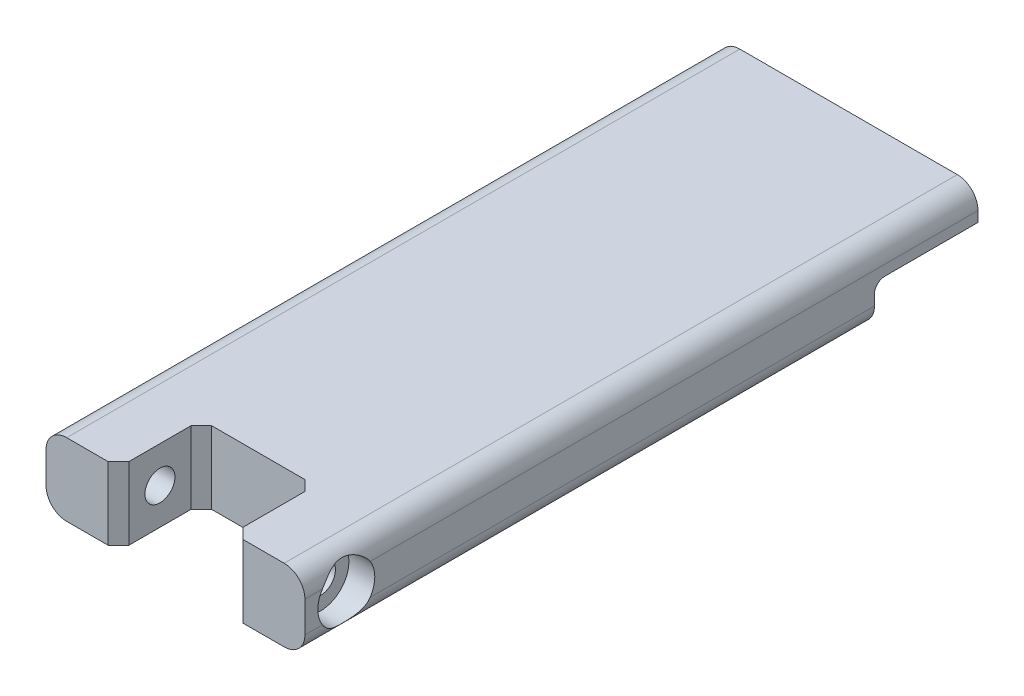
ISO-10303-21;
HEADER;
FILE_DESCRIPTION(('STEP AP214'),'2;1');
FILE_NAME('part.step','',(''),(''),'','','');
FILE_SCHEMA(('AUTOMOTIVE_DESIGN { 1 0 10303 214 1 1 1 1 }'));
ENDSEC;
DATA;
#1=APPLICATION_CONTEXT('core data for automotive mechanical design processes');
#2=APPLICATION_PROTOCOL_DEFINITION('international standard','automotive_design',2000,#1);
#3=PRODUCT_CONTEXT('',#1,'mechanical');
#4=PRODUCT('Part','Part','',(#3));
#5=PRODUCT_RELATED_PRODUCT_CATEGORY('part','',(#4));
#6=PRODUCT_DEFINITION_FORMATION('','',#4);
#7=PRODUCT_DEFINITION_CONTEXT('part definition',#1,'design');
#8=PRODUCT_DEFINITION('design','',#6,#7);
#9=PRODUCT_DEFINITION_SHAPE('','',#8);
#10=(LENGTH_UNIT() NAMED_UNIT(*) SI_UNIT(.MILLI.,.METRE.));
#11=(NAMED_UNIT(*) PLANE_ANGLE_UNIT() SI_UNIT($,.RADIAN.));
#12=(NAMED_UNIT(*) SI_UNIT($,.STERADIAN.) SOLID_ANGLE_UNIT());
#13=UNCERTAINTY_MEASURE_WITH_UNIT(LENGTH_MEASURE(1.E-05),#10,'distance_accuracy_value','');
#14=(GEOMETRIC_REPRESENTATION_CONTEXT(3) GLOBAL_UNCERTAINTY_ASSIGNED_CONTEXT((#13)) GLOBAL_UNIT_ASSIGNED_CONTEXT((#10,
#11,#12)) REPRESENTATION_CONTEXT('',''));
#15=CARTESIAN_POINT('',(0.,0.,0.));
#16=DIRECTION('',(0.,0.,1.));
#17=DIRECTION('',(1.,0.,0.));
#18=AXIS2_PLACEMENT_3D('',#15,#16,#17);
#19=CARTESIAN_POINT('',(-12.5,-3.5,65.));
#20=DIRECTION('',(0.,1.,0.));
#21=DIRECTION('',(0.,0.,1.));
#22=AXIS2_PLACEMENT_3D('',#19,#20,#21);
#23=PLANE('',#22);
#24=DIRECTION('',(-1.,0.,0.));
#25=VECTOR('',#24,1.);
#26=CARTESIAN_POINT('',(12.5,-3.5,10.));
#27=LINE('',#26,#25);
#28=CARTESIAN_POINT('',(10.5,-3.5,10.));
#29=VERTEX_POINT('',#28);
#30=CARTESIAN_POINT('',(-10.5,-3.5,10.));
#31=VERTEX_POINT('',#30);
#32=EDGE_CURVE('E411',#29,#31,#27,.T.);
#33=ORIENTED_EDGE('',*,*,#32,.F.);
#34=DIRECTION('',(0.,0.,-1.));
#35=VECTOR('',#34,1.);
#36=CARTESIAN_POINT('',(10.5,-3.5,65.));
#37=LINE('',#36,#35);
#38=CARTESIAN_POINT('',(10.5,-3.5,65.));
#39=VERTEX_POINT('',#38);
#40=EDGE_CURVE('E424',#29,#39,#37,.F.);
#41=ORIENTED_EDGE('',*,*,#40,.T.);
#42=DIRECTION('',(1.,0.,0.));
#43=VECTOR('',#42,1.);
#44=CARTESIAN_POINT('',(-12.5,-3.5,65.));
#45=LINE('',#44,#43);
#46=CARTESIAN_POINT('',(6.49999999999999,-3.5,65.));
#47=VERTEX_POINT('',#46);
#48=EDGE_CURVE('E364',#47,#39,#45,.T.);
#49=ORIENTED_EDGE('',*,*,#48,.F.);
#50=DIRECTION('',(0.707106781186545,0.,0.70710678118655));
#51=VECTOR('',#50,1.);
#52=CARTESIAN_POINT('',(5.5,-3.5,64.));
#53=LINE('',#52,#51);
#54=CARTESIAN_POINT('',(5.5,-3.5,64.));
#55=VERTEX_POINT('',#54);
#56=EDGE_CURVE('E454',#47,#55,#53,.F.);
#57=ORIENTED_EDGE('',*,*,#56,.T.);
#58=DIRECTION('',(0.,0.,-1.));
#59=VECTOR('',#58,1.);
#60=CARTESIAN_POINT('',(5.5,-3.5,65.));
#61=LINE('',#60,#59);
#62=CARTESIAN_POINT('',(5.5,-3.5,58.));
#63=VERTEX_POINT('',#62);
#64=EDGE_CURVE('E373',#55,#63,#61,.T.);
#65=ORIENTED_EDGE('',*,*,#64,.T.);
#66=DIRECTION('',(0.70710678118655,0.,0.707106781186545));
#67=VECTOR('',#66,1.);
#68=CARTESIAN_POINT('',(0.,-3.5,52.5));
#69=LINE('',#68,#67);
#70=CARTESIAN_POINT('',(4.49999999999999,-3.5,57.));
#71=VERTEX_POINT('',#70);
#72=EDGE_CURVE('E221',#63,#71,#69,.F.);
#73=ORIENTED_EDGE('',*,*,#72,.T.);
#74=DIRECTION('',(-1.,0.,0.));
#75=VECTOR('',#74,1.);
#76=CARTESIAN_POINT('',(-5.50000000000001,-3.5,57.));
#77=LINE('',#76,#75);
#78=CARTESIAN_POINT('',(-4.50000000000001,-3.5,57.));
#79=VERTEX_POINT('',#78);
#80=EDGE_CURVE('E371',#71,#79,#77,.T.);
#81=ORIENTED_EDGE('',*,*,#80,.T.);
#82=DIRECTION('',(0.707106781186545,0.,-0.70710678118655));
#83=VECTOR('',#82,1.);
#84=CARTESIAN_POINT('',(-12.5,-3.5,65.));
#85=LINE('',#84,#83);
#86=CARTESIAN_POINT('',(-5.50000000000001,-3.5,58.));
#87=VERTEX_POINT('',#86);
#88=EDGE_CURVE('E225',#79,#87,#85,.F.);
#89=ORIENTED_EDGE('',*,*,#88,.T.);
#90=DIRECTION('',(0.,0.,1.));
#91=VECTOR('',#90,1.);
#92=CARTESIAN_POINT('',(-5.50000000000001,-3.5,65.));
#93=LINE('',#92,#91);
#94=CARTESIAN_POINT('',(-5.50000000000001,-3.5,64.));
#95=VERTEX_POINT('',#94);
#96=EDGE_CURVE('E377',#87,#95,#93,.T.);
#97=ORIENTED_EDGE('',*,*,#96,.T.);
#98=DIRECTION('',(0.70710678118654,0.,-0.707106781186555));
#99=VECTOR('',#98,1.);
#100=CARTESIAN_POINT('',(-6.50000000000001,-3.5,65.));
#101=LINE('',#100,#99);
#102=CARTESIAN_POINT('',(-6.50000000000001,-3.5,65.));
#103=VERTEX_POINT('',#102);
#104=EDGE_CURVE('E452',#95,#103,#101,.F.);
#105=ORIENTED_EDGE('',*,*,#104,.T.);
#106=CARTESIAN_POINT('',(-10.5,-3.5,65.));
#107=VERTEX_POINT('',#106);
#108=EDGE_CURVE('E209',#107,#103,#45,.T.);
#109=ORIENTED_EDGE('',*,*,#108,.F.);
#110=DIRECTION('',(0.,0.,-1.));
#111=VECTOR('',#110,1.);
#112=CARTESIAN_POINT('',(-10.5,-3.5,65.));
#113=LINE('',#112,#111);
#114=EDGE_CURVE('E441',#107,#31,#113,.T.);
#115=ORIENTED_EDGE('',*,*,#114,.T.);
#116=EDGE_LOOP('',(#33,#41,#49,#57,#65,#73,#81,#89,#97,#105,#109,#115));
#117=FACE_BOUND('',#116,.T.);
#118=ADVANCED_FACE('F33',(#117),#23,.F.);
#119=CARTESIAN_POINT('',(-10.5,-1.5,65.));
#120=DIRECTION('',(0.,0.,-1.));
#121=DIRECTION('',(-1.,0.,0.));
#122=AXIS2_PLACEMENT_3D('',#119,#120,#121);
#123=CYLINDRICAL_SURFACE('',#122,2.);
#124=DIRECTION('',(0.,0.,-1.));
#125=VECTOR('',#124,1.);
#126=CARTESIAN_POINT('',(-12.5,-1.5,65.));
#127=LINE('',#126,#125);
#128=CARTESIAN_POINT('',(-12.5,-1.5,10.));
#129=VERTEX_POINT('',#128);
#130=CARTESIAN_POINT('',(-12.5,-1.5,65.));
#131=VERTEX_POINT('',#130);
#132=EDGE_CURVE('E227',#129,#131,#127,.F.);
#133=ORIENTED_EDGE('',*,*,#132,.F.);
#134=CARTESIAN_POINT('',(-10.5,-1.5,10.));
#135=DIRECTION('',(0.,0.,-1.));
#136=DIRECTION('',(-1.,0.,0.));
#137=AXIS2_PLACEMENT_3D('',#134,#135,#136);
#138=CIRCLE('',#137,2.);
#139=EDGE_CURVE('E354',#129,#31,#138,.F.);
#140=ORIENTED_EDGE('',*,*,#139,.T.);
#141=ORIENTED_EDGE('',*,*,#114,.F.);
#142=CARTESIAN_POINT('',(-10.5,-1.5,65.));
#143=DIRECTION('',(0.,0.,-1.));
#144=DIRECTION('',(-1.,0.,0.));
#145=AXIS2_PLACEMENT_3D('',#142,#143,#144);
#146=CIRCLE('',#145,2.);
#147=EDGE_CURVE('E245',#131,#107,#146,.F.);
#148=ORIENTED_EDGE('',*,*,#147,.F.);
#149=EDGE_LOOP('',(#133,#140,#141,#148));
#150=FACE_BOUND('',#149,.T.);
#151=ADVANCED_FACE('F317',(#150),#123,.T.);
#152=CARTESIAN_POINT('',(10.5,-1.5,65.));
#153=DIRECTION('',(0.,0.,-1.));
#154=DIRECTION('',(-1.,0.,0.));
#155=AXIS2_PLACEMENT_3D('',#152,#153,#154);
#156=CYLINDRICAL_SURFACE('',#155,2.);
#157=ORIENTED_EDGE('',*,*,#40,.F.);
#158=CARTESIAN_POINT('',(10.5,-1.5,10.));
#159=DIRECTION('',(0.,0.,-1.));
#160=DIRECTION('',(-1.,0.,0.));
#161=AXIS2_PLACEMENT_3D('',#158,#159,#160);
#162=CIRCLE('',#161,2.);
#163=CARTESIAN_POINT('',(12.5,-1.5,10.));
#164=VERTEX_POINT('',#163);
#165=EDGE_CURVE('E417',#29,#164,#162,.F.);
#166=ORIENTED_EDGE('',*,*,#165,.T.);
#167=DIRECTION('',(0.,0.,-1.));
#168=VECTOR('',#167,1.);
#169=CARTESIAN_POINT('',(12.5,-1.5,65.));
#170=LINE('',#169,#168);
#171=CARTESIAN_POINT('',(12.5,-1.5,58.6951138856773));
#172=VERTEX_POINT('',#171);
#173=EDGE_CURVE('E249',#172,#164,#170,.T.);
#174=ORIENTED_EDGE('',*,*,#173,.F.);
#175=CARTESIAN_POINT('',(12.5,-1.5,63.3048861143238));
#176=CARTESIAN_POINT('',(12.5000031455247,-1.55654719040747,63.2681015960545));
#177=CARTESIAN_POINT('',(12.4976030423075,-1.61168036140284,63.229244799416));
#178=CARTESIAN_POINT('',(12.4887327039993,-1.71866391916392,63.1478326561493));
#179=CARTESIAN_POINT('',(12.4822692231237,-1.77051959672422,63.1052835479124));
#180=CARTESIAN_POINT('',(12.4660769723939,-1.87023190709926,63.0172070499416));
#181=CARTESIAN_POINT('',(12.4563781599825,-1.91812037296953,62.9717099624892));
#182=CARTESIAN_POINT('',(12.4344014916754,-2.01022961709538,62.8777141967953));
#183=CARTESIAN_POINT('',(12.4221225443847,-2.05444883218452,62.829214254492));
#184=CARTESIAN_POINT('',(12.3826073001845,-2.18084035421773,62.6802695256216));
#185=CARTESIAN_POINT('',(12.3525619459295,-2.25743750555092,62.5757649259126));
#186=CARTESIAN_POINT('',(12.2900544015329,-2.39524100849854,62.357251168495));
#187=CARTESIAN_POINT('',(12.2575824702803,-2.45638047473159,62.2432034551855));
#188=CARTESIAN_POINT('',(12.1890009678127,-2.57370289713175,61.9814311601407));
#189=CARTESIAN_POINT('',(12.1535974487112,-2.62603303821094,61.8317188596248));
#190=CARTESIAN_POINT('',(12.1114688180424,-2.684796803544,61.6005625477079));
#191=CARTESIAN_POINT('',(12.0992647544686,-2.70108714983043,61.5225254315704));
#192=CARTESIAN_POINT('',(12.0795714424916,-2.72687504946342,61.3647323506282));
#193=CARTESIAN_POINT('',(12.0720805471391,-2.73637497578302,61.284976996324));
#194=CARTESIAN_POINT('',(12.0631457118318,-2.74764546944497,61.1340798855246));
#195=CARTESIAN_POINT('',(12.0610929340044,-2.75019531169201,61.0630312854767));
#196=CARTESIAN_POINT('',(12.0614247125385,-2.74978139960178,60.9209632345931));
#197=CARTESIAN_POINT('',(12.0638089539989,-2.74681803654396,60.8499437820466));
#198=CARTESIAN_POINT('',(12.0728200507609,-2.73543063833603,60.7085253878801));
#199=CARTESIAN_POINT('',(12.0794524513349,-2.72699946568053,60.6381273793954));
#200=CARTESIAN_POINT('',(12.0964251242216,-2.70483145596675,60.4986155034108));
#201=CARTESIAN_POINT('',(12.1067676975421,-2.69109132594348,60.4295024608732));
#202=CARTESIAN_POINT('',(12.144341342272,-2.6393296038762,60.2127876199724));
#203=CARTESIAN_POINT('',(12.1771439150733,-2.59173999499547,60.0683045143319));
#204=CARTESIAN_POINT('',(12.2302751739441,-2.50365392645819,59.8598455295542));
#205=CARTESIAN_POINT('',(12.2486732126794,-2.47144240385068,59.7916329045371));
#206=CARTESIAN_POINT('',(12.2857040022015,-2.4015705978906,59.6581231297031));
#207=CARTESIAN_POINT('',(12.3043367524611,-2.36391032677158,59.5928259733408));
#208=CARTESIAN_POINT('',(12.359683505685,-2.24140451758164,59.3993275811268));
#209=CARTESIAN_POINT('',(12.3951674318541,-2.1480412863694,59.2759132159634));
#210=CARTESIAN_POINT('',(12.4391492572644,-1.9925408853583,59.103089712563));
#211=CARTESIAN_POINT('',(12.4522530154153,-1.93824915848586,59.0476252909338));
#212=CARTESIAN_POINT('',(12.4743077235745,-1.82471924321772,58.9411319040245));
#213=CARTESIAN_POINT('',(12.4832629090084,-1.76548617287077,58.8900984584625));
#214=CARTESIAN_POINT('',(12.4929285728009,-1.67124019405483,58.8156913557658));
#215=CARTESIAN_POINT('',(12.4955363567126,-1.63781976970446,58.7905209062592));
#216=CARTESIAN_POINT('',(12.4990728191799,-1.56977969514719,58.7416713901846));
#217=CARTESIAN_POINT('',(12.5000001080821,-1.53515907654759,58.7179935735217));
#218=CARTESIAN_POINT('',(12.5,-1.5,58.6951138856773));
#219=B_SPLINE_CURVE_WITH_KNOTS('',3,(#175,#176,#177,#178,#179,#180,#181,#182,#183,#184,#185,
#186,#187,#188,#189,#190,#191,#192,#193,#194,#195,#196,#197,#198,#199,#200,#201,#202,#203,#204,
#205,#206,#207,#208,#209,#210,#211,#212,#213,#214,#215,#216,#217,#218),.UNSPECIFIED.,.F.,.F.,(4,
2,2,2,2,2,2,2,2,2,2,2,2,2,2,2,2,2,2,2,2,4),(0.,0.202207318065069,0.404079409178731,
0.604131887594807,0.804269159006677,1.20177087458337,1.60096422595491,2.08548459343883,
2.32707444122814,2.56857982195212,2.78161011892904,2.99462529744102,3.20791910043911,
3.42134541523357,3.88535369353779,4.11811425556195,4.35087429499951,4.8243625529269,
5.06021259924734,5.29582132430261,5.42151284487231,5.54730825630761),.UNSPECIFIED.);
#220=CARTESIAN_POINT('',(12.5,-1.5,63.3048861143238));
#221=VERTEX_POINT('',#220);
#222=EDGE_CURVE('E259',#221,#172,#219,.T.);
#223=ORIENTED_EDGE('',*,*,#222,.F.);
#224=DIRECTION('',(0.,0.,-1.));
#225=VECTOR('',#224,1.);
#226=CARTESIAN_POINT('',(12.5,-1.5,65.));
#227=LINE('',#226,#225);
#228=CARTESIAN_POINT('',(12.5,-1.5,65.));
#229=VERTEX_POINT('',#228);
#230=EDGE_CURVE('E252',#229,#221,#227,.T.);
#231=ORIENTED_EDGE('',*,*,#230,.F.);
#232=CARTESIAN_POINT('',(10.5,-1.5,65.));
#233=DIRECTION('',(0.,0.,-1.));
#234=DIRECTION('',(-1.,0.,0.));
#235=AXIS2_PLACEMENT_3D('',#232,#233,#234);
#236=CIRCLE('',#235,2.);
#237=EDGE_CURVE('E435',#39,#229,#236,.F.);
#238=ORIENTED_EDGE('',*,*,#237,.F.);
#239=EDGE_LOOP('',(#157,#166,#174,#223,#231,#238));
#240=FACE_BOUND('',#239,.T.);
#241=ADVANCED_FACE('F272',(#240),#156,.T.);
#242=CARTESIAN_POINT('',(12.5,-3.5,65.));
#243=DIRECTION('',(-1.,0.,0.));
#244=DIRECTION('',(0.,0.,1.));
#245=AXIS2_PLACEMENT_3D('',#242,#243,#244);
#246=PLANE('',#245);
#247=DIRECTION('',(0.,-1.,0.));
#248=VECTOR('',#247,1.);
#249=CARTESIAN_POINT('',(12.5,0.5,10.));
#250=LINE('',#249,#248);
#251=CARTESIAN_POINT('',(12.5,-0.5,10.));
#252=VERTEX_POINT('',#251);
#253=EDGE_CURVE('E189',#252,#164,#250,.T.);
#254=ORIENTED_EDGE('',*,*,#253,.F.);
#255=CARTESIAN_POINT('',(12.5,-0.5,9.));
#256=DIRECTION('',(-1.,0.,0.));
#257=DIRECTION('',(0.,0.,1.));
#258=AXIS2_PLACEMENT_3D('',#255,#256,#257);
#259=CIRCLE('',#258,1.);
#260=CARTESIAN_POINT('',(12.5,0.5,9.));
#261=VERTEX_POINT('',#260);
#262=EDGE_CURVE('E41',#252,#261,#259,.T.);
#263=ORIENTED_EDGE('',*,*,#262,.T.);
#264=DIRECTION('',(0.,0.,-1.));
#265=VECTOR('',#264,1.);
#266=CARTESIAN_POINT('',(12.5,0.5,10.));
#267=LINE('',#266,#265);
#268=CARTESIAN_POINT('',(12.5,0.5,0.));
#269=VERTEX_POINT('',#268);
#270=EDGE_CURVE('E180',#261,#269,#267,.T.);
#271=ORIENTED_EDGE('',*,*,#270,.T.);
#272=DIRECTION('',(0.,1.,0.));
#273=VECTOR('',#272,1.);
#274=CARTESIAN_POINT('',(12.5,-3.5,0.));
#275=LINE('',#274,#273);
#276=CARTESIAN_POINT('',(12.5,1.5,0.));
#277=VERTEX_POINT('',#276);
#278=EDGE_CURVE('E188',#269,#277,#275,.T.);
#279=ORIENTED_EDGE('',*,*,#278,.T.);
#280=DIRECTION('',(0.,0.,-1.));
#281=VECTOR('',#280,1.);
#282=CARTESIAN_POINT('',(12.5,1.5,65.));
#283=LINE('',#282,#281);
#284=CARTESIAN_POINT('',(12.5,1.5,58.6951138856773));
#285=VERTEX_POINT('',#284);
#286=EDGE_CURVE('E257',#277,#285,#283,.F.);
#287=ORIENTED_EDGE('',*,*,#286,.T.);
#288=CARTESIAN_POINT('',(12.5,0.,61.0000000000006));
#289=DIRECTION('',(1.,0.,0.));
#290=DIRECTION('',(0.,0.,-1.));
#291=AXIS2_PLACEMENT_3D('',#288,#289,#290);
#292=CIRCLE('',#291,2.75);
#293=EDGE_CURVE('E405',#172,#285,#292,.T.);
#294=ORIENTED_EDGE('',*,*,#293,.F.);
#295=ORIENTED_EDGE('',*,*,#173,.T.);
#296=EDGE_LOOP('',(#254,#263,#271,#279,#287,#294,#295));
#297=FACE_BOUND('',#296,.T.);
#298=ADVANCED_FACE('F330',(#297),#246,.F.);
#299=CARTESIAN_POINT('',(0.,0.,65.));
#300=DIRECTION('',(0.,0.,-1.));
#301=DIRECTION('',(-1.,0.,0.));
#302=AXIS2_PLACEMENT_3D('',#299,#300,#301);
#303=PLANE('',#302);
#304=ORIENTED_EDGE('',*,*,#108,.T.);
#305=DIRECTION('',(0.,1.,0.));
#306=VECTOR('',#305,1.);
#307=CARTESIAN_POINT('',(-6.50000000000001,0.,65.));
#308=LINE('',#307,#306);
#309=CARTESIAN_POINT('',(-6.50000000000001,3.5,65.));
#310=VERTEX_POINT('',#309);
#311=EDGE_CURVE('E456',#103,#310,#308,.T.);
#312=ORIENTED_EDGE('',*,*,#311,.T.);
#313=DIRECTION('',(-1.,0.,0.));
#314=VECTOR('',#313,1.);
#315=CARTESIAN_POINT('',(-12.5,3.5,65.));
#316=LINE('',#315,#314);
#317=CARTESIAN_POINT('',(-10.5,3.5,65.));
#318=VERTEX_POINT('',#317);
#319=EDGE_CURVE('E200',#310,#318,#316,.T.);
#320=ORIENTED_EDGE('',*,*,#319,.T.);
#321=CARTESIAN_POINT('',(-10.5,1.5,65.));
#322=DIRECTION('',(0.,0.,-1.));
#323=DIRECTION('',(-1.,0.,0.));
#324=AXIS2_PLACEMENT_3D('',#321,#322,#323);
#325=CIRCLE('',#324,2.);
#326=CARTESIAN_POINT('',(-12.5,1.5,65.));
#327=VERTEX_POINT('',#326);
#328=EDGE_CURVE('E247',#318,#327,#325,.F.);
#329=ORIENTED_EDGE('',*,*,#328,.T.);
#330=DIRECTION('',(0.,-1.,0.));
#331=VECTOR('',#330,1.);
#332=CARTESIAN_POINT('',(-12.5,-3.5,65.));
#333=LINE('',#332,#331);
#334=EDGE_CURVE('E358',#327,#131,#333,.T.);
#335=ORIENTED_EDGE('',*,*,#334,.T.);
#336=ORIENTED_EDGE('',*,*,#147,.T.);
#337=EDGE_LOOP('',(#304,#312,#320,#329,#335,#336));
#338=FACE_BOUND('',#337,.T.);
#339=ADVANCED_FACE('F312',(#338),#303,.F.);
#340=CARTESIAN_POINT('',(12.5,1.5,63.3048861143238));
#341=VERTEX_POINT('',#340);
#342=EDGE_CURVE('E404',#341,#221,#292,.T.);
#343=ORIENTED_EDGE('',*,*,#342,.F.);
#344=DIRECTION('',(0.,0.,-1.));
#345=VECTOR('',#344,1.);
#346=CARTESIAN_POINT('',(12.5,1.5,65.));
#347=LINE('',#346,#345);
#348=CARTESIAN_POINT('',(12.5,1.5,65.));
#349=VERTEX_POINT('',#348);
#350=EDGE_CURVE('E255',#341,#349,#347,.F.);
#351=ORIENTED_EDGE('',*,*,#350,.T.);
#352=DIRECTION('',(0.,1.,0.));
#353=VECTOR('',#352,1.);
#354=CARTESIAN_POINT('',(12.5,-3.5,65.));
#355=LINE('',#354,#353);
#356=EDGE_CURVE('E196',#229,#349,#355,.T.);
#357=ORIENTED_EDGE('',*,*,#356,.F.);
#358=ORIENTED_EDGE('',*,*,#230,.T.);
#359=EDGE_LOOP('',(#343,#351,#357,#358));
#360=FACE_BOUND('',#359,.T.);
#361=ADVANCED_FACE('F325',(#360),#246,.F.);
#362=CARTESIAN_POINT('',(-12.5,3.5,65.));
#363=DIRECTION('',(0.,-1.,0.));
#364=DIRECTION('',(0.,0.,-1.));
#365=AXIS2_PLACEMENT_3D('',#362,#363,#364);
#366=PLANE('',#365);
#367=DIRECTION('',(0.,0.,-1.));
#368=VECTOR('',#367,1.);
#369=CARTESIAN_POINT('',(5.5,3.5,65.));
#370=LINE('',#369,#368);
#371=CARTESIAN_POINT('',(5.5,3.5,64.));
#372=VERTEX_POINT('',#371);
#373=CARTESIAN_POINT('',(5.5,3.5,58.));
#374=VERTEX_POINT('',#373);
#375=EDGE_CURVE('E384',#372,#374,#370,.T.);
#376=ORIENTED_EDGE('',*,*,#375,.F.);
#377=DIRECTION('',(-0.707106781186545,0.,-0.70710678118655));
#378=VECTOR('',#377,1.);
#379=CARTESIAN_POINT('',(5.5,3.5,64.));
#380=LINE('',#379,#378);
#381=CARTESIAN_POINT('',(6.49999999999999,3.5,65.));
#382=VERTEX_POINT('',#381);
#383=EDGE_CURVE('E448',#372,#382,#380,.F.);
#384=ORIENTED_EDGE('',*,*,#383,.T.);
#385=CARTESIAN_POINT('',(10.5,3.5,65.));
#386=VERTEX_POINT('',#385);
#387=EDGE_CURVE('E365',#386,#382,#316,.T.);
#388=ORIENTED_EDGE('',*,*,#387,.F.);
#389=DIRECTION('',(0.,0.,-1.));
#390=VECTOR('',#389,1.);
#391=CARTESIAN_POINT('',(10.5,3.5,65.));
#392=LINE('',#391,#390);
#393=CARTESIAN_POINT('',(10.5,3.5,0.));
#394=VERTEX_POINT('',#393);
#395=EDGE_CURVE('E239',#386,#394,#392,.T.);
#396=ORIENTED_EDGE('',*,*,#395,.T.);
#397=DIRECTION('',(-1.,0.,0.));
#398=VECTOR('',#397,1.);
#399=CARTESIAN_POINT('',(-12.5,3.5,0.));
#400=LINE('',#399,#398);
#401=CARTESIAN_POINT('',(-10.5,3.5,0.));
#402=VERTEX_POINT('',#401);
#403=EDGE_CURVE('E197',#394,#402,#400,.T.);
#404=ORIENTED_EDGE('',*,*,#403,.T.);
#405=DIRECTION('',(0.,0.,-1.));
#406=VECTOR('',#405,1.);
#407=CARTESIAN_POINT('',(-10.5,3.5,65.));
#408=LINE('',#407,#406);
#409=EDGE_CURVE('E242',#402,#318,#408,.F.);
#410=ORIENTED_EDGE('',*,*,#409,.T.);
#411=ORIENTED_EDGE('',*,*,#319,.F.);
#412=DIRECTION('',(-0.70710678118654,0.,0.707106781186555));
#413=VECTOR('',#412,1.);
#414=CARTESIAN_POINT('',(-6.50000000000001,3.5,65.));
#415=LINE('',#414,#413);
#416=CARTESIAN_POINT('',(-5.50000000000001,3.5,64.));
#417=VERTEX_POINT('',#416);
#418=EDGE_CURVE('E446',#310,#417,#415,.F.);
#419=ORIENTED_EDGE('',*,*,#418,.T.);
#420=DIRECTION('',(0.,0.,1.));
#421=VECTOR('',#420,1.);
#422=CARTESIAN_POINT('',(-5.50000000000001,3.5,65.));
#423=LINE('',#422,#421);
#424=CARTESIAN_POINT('',(-5.50000000000001,3.5,58.));
#425=VERTEX_POINT('',#424);
#426=EDGE_CURVE('E381',#425,#417,#423,.T.);
#427=ORIENTED_EDGE('',*,*,#426,.F.);
#428=DIRECTION('',(-0.707106781186545,0.,0.70710678118655));
#429=VECTOR('',#428,1.);
#430=CARTESIAN_POINT('',(-12.5,3.5,65.));
#431=LINE('',#430,#429);
#432=CARTESIAN_POINT('',(-4.50000000000001,3.5,57.));
#433=VERTEX_POINT('',#432);
#434=EDGE_CURVE('E223',#425,#433,#431,.F.);
#435=ORIENTED_EDGE('',*,*,#434,.T.);
#436=DIRECTION('',(-1.,0.,0.));
#437=VECTOR('',#436,1.);
#438=CARTESIAN_POINT('',(-5.50000000000001,3.5,57.));
#439=LINE('',#438,#437);
#440=CARTESIAN_POINT('',(4.49999999999999,3.5,57.));
#441=VERTEX_POINT('',#440);
#442=EDGE_CURVE('E386',#441,#433,#439,.T.);
#443=ORIENTED_EDGE('',*,*,#442,.F.);
#444=DIRECTION('',(-0.70710678118655,0.,-0.707106781186545));
#445=VECTOR('',#444,1.);
#446=CARTESIAN_POINT('',(0.,3.5,52.5));
#447=LINE('',#446,#445);
#448=EDGE_CURVE('E218',#441,#374,#447,.F.);
#449=ORIENTED_EDGE('',*,*,#448,.T.);
#450=EDGE_LOOP('',(#376,#384,#388,#396,#404,#410,#411,#419,#427,#435,#443,#449));
#451=FACE_BOUND('',#450,.T.);
#452=ADVANCED_FACE('F321',(#451),#366,.F.);
#453=CARTESIAN_POINT('',(-12.5,-3.5,65.));
#454=DIRECTION('',(1.,0.,0.));
#455=DIRECTION('',(0.,0.,-1.));
#456=AXIS2_PLACEMENT_3D('',#453,#454,#455);
#457=PLANE('',#456);
#458=CARTESIAN_POINT('',(-12.5,0.,61.0000000000006));
#459=DIRECTION('',(1.,0.,0.));
#460=DIRECTION('',(0.,0.,-1.));
#461=AXIS2_PLACEMENT_3D('',#458,#459,#460);
#462=CIRCLE('',#461,1.44999999999999);
#463=CARTESIAN_POINT('',(-12.5,0.,59.5500000000006));
#464=VERTEX_POINT('',#463);
#465=EDGE_CURVE('E232',#464,#464,#462,.T.);
#466=ORIENTED_EDGE('',*,*,#465,.T.);
#467=EDGE_LOOP('',(#466));
#468=FACE_BOUND('',#467,.T.);
#469=DIRECTION('',(0.,-1.,0.));
#470=VECTOR('',#469,1.);
#471=CARTESIAN_POINT('',(-12.5,-3.5,0.));
#472=LINE('',#471,#470);
#473=CARTESIAN_POINT('',(-12.5,1.5,0.));
#474=VERTEX_POINT('',#473);
#475=CARTESIAN_POINT('',(-12.5,0.5,0.));
#476=VERTEX_POINT('',#475);
#477=EDGE_CURVE('E186',#474,#476,#472,.T.);
#478=ORIENTED_EDGE('',*,*,#477,.T.);
#479=DIRECTION('',(0.,0.,-1.));
#480=VECTOR('',#479,1.);
#481=CARTESIAN_POINT('',(-12.5,0.5,10.));
#482=LINE('',#481,#480);
#483=CARTESIAN_POINT('',(-12.5,0.5,9.));
#484=VERTEX_POINT('',#483);
#485=EDGE_CURVE('E172',#484,#476,#482,.T.);
#486=ORIENTED_EDGE('',*,*,#485,.F.);
#487=CARTESIAN_POINT('',(-12.5,-0.5,9.));
#488=DIRECTION('',(1.,0.,0.));
#489=DIRECTION('',(0.,0.,-1.));
#490=AXIS2_PLACEMENT_3D('',#487,#488,#489);
#491=CIRCLE('',#490,1.);
#492=CARTESIAN_POINT('',(-12.5,-0.5,10.));
#493=VERTEX_POINT('',#492);
#494=EDGE_CURVE('E11',#484,#493,#491,.T.);
#495=ORIENTED_EDGE('',*,*,#494,.T.);
#496=DIRECTION('',(0.,1.,0.));
#497=VECTOR('',#496,1.);
#498=CARTESIAN_POINT('',(-12.5,0.5,10.));
#499=LINE('',#498,#497);
#500=EDGE_CURVE('E181',#129,#493,#499,.T.);
#501=ORIENTED_EDGE('',*,*,#500,.F.);
#502=ORIENTED_EDGE('',*,*,#132,.T.);
#503=ORIENTED_EDGE('',*,*,#334,.F.);
#504=DIRECTION('',(0.,0.,-1.));
#505=VECTOR('',#504,1.);
#506=CARTESIAN_POINT('',(-12.5,1.5,65.));
#507=LINE('',#506,#505);
#508=EDGE_CURVE('E195',#327,#474,#507,.T.);
#509=ORIENTED_EDGE('',*,*,#508,.T.);
#510=EDGE_LOOP('',(#478,#486,#495,#501,#502,#503,#509));
#511=FACE_BOUND('',#510,.T.);
#512=ADVANCED_FACE('F192',(#468,#511),#457,.F.);
#513=ORIENTED_EDGE('',*,*,#387,.T.);
#514=DIRECTION('',(0.,-1.,0.));
#515=VECTOR('',#514,1.);
#516=CARTESIAN_POINT('',(6.49999999999999,0.,65.));
#517=LINE('',#516,#515);
#518=EDGE_CURVE('E450',#382,#47,#517,.T.);
#519=ORIENTED_EDGE('',*,*,#518,.T.);
#520=ORIENTED_EDGE('',*,*,#48,.T.);
#521=ORIENTED_EDGE('',*,*,#237,.T.);
#522=ORIENTED_EDGE('',*,*,#356,.T.);
#523=CARTESIAN_POINT('',(10.5,1.5,65.));
#524=DIRECTION('',(0.,0.,-1.));
#525=DIRECTION('',(-1.,0.,0.));
#526=AXIS2_PLACEMENT_3D('',#523,#524,#525);
#527=CIRCLE('',#526,2.);
#528=EDGE_CURVE('E436',#349,#386,#527,.F.);
#529=ORIENTED_EDGE('',*,*,#528,.T.);
#530=EDGE_LOOP('',(#513,#519,#520,#521,#522,#529));
#531=FACE_BOUND('',#530,.T.);
#532=ADVANCED_FACE('F308',(#531),#303,.F.);
#533=CARTESIAN_POINT('',(0.,0.,0.));
#534=DIRECTION('',(0.,0.,-1.));
#535=DIRECTION('',(-1.,0.,0.));
#536=AXIS2_PLACEMENT_3D('',#533,#534,#535);
#537=PLANE('',#536);
#538=DIRECTION('',(1.,0.,0.));
#539=VECTOR('',#538,1.);
#540=CARTESIAN_POINT('',(12.5,0.5,0.));
#541=LINE('',#540,#539);
#542=EDGE_CURVE('E175',#476,#269,#541,.T.);
#543=ORIENTED_EDGE('',*,*,#542,.F.);
#544=ORIENTED_EDGE('',*,*,#477,.F.);
#545=CARTESIAN_POINT('',(-10.5,1.5,0.));
#546=DIRECTION('',(0.,0.,-1.));
#547=DIRECTION('',(-1.,0.,0.));
#548=AXIS2_PLACEMENT_3D('',#545,#546,#547);
#549=CIRCLE('',#548,2.);
#550=EDGE_CURVE('E237',#474,#402,#549,.T.);
#551=ORIENTED_EDGE('',*,*,#550,.T.);
#552=ORIENTED_EDGE('',*,*,#403,.F.);
#553=CARTESIAN_POINT('',(10.5,1.5,0.));
#554=DIRECTION('',(0.,0.,-1.));
#555=DIRECTION('',(-1.,0.,0.));
#556=AXIS2_PLACEMENT_3D('',#553,#554,#555);
#557=CIRCLE('',#556,2.);
#558=EDGE_CURVE('E235',#394,#277,#557,.T.);
#559=ORIENTED_EDGE('',*,*,#558,.T.);
#560=ORIENTED_EDGE('',*,*,#278,.F.);
#561=EDGE_LOOP('',(#543,#544,#551,#552,#559,#560));
#562=FACE_BOUND('',#561,.T.);
#563=ADVANCED_FACE('F185',(#562),#537,.T.);
#564=CARTESIAN_POINT('',(-5.50000000000001,-3.5,65.));
#565=DIRECTION('',(-1.,0.,0.));
#566=DIRECTION('',(0.,0.,1.));
#567=AXIS2_PLACEMENT_3D('',#564,#565,#566);
#568=PLANE('',#567);
#569=CARTESIAN_POINT('',(-5.50000000000001,0.,61.0000000000006));
#570=DIRECTION('',(-1.,0.,0.));
#571=DIRECTION('',(0.,0.,1.));
#572=AXIS2_PLACEMENT_3D('',#569,#570,#571);
#573=CIRCLE('',#572,1.45);
#574=CARTESIAN_POINT('',(-5.50000000000001,0.,62.4500000000006));
#575=VERTEX_POINT('',#574);
#576=EDGE_CURVE('E231',#575,#575,#573,.T.);
#577=ORIENTED_EDGE('',*,*,#576,.T.);
#578=EDGE_LOOP('',(#577));
#579=FACE_BOUND('',#578,.T.);
#580=ORIENTED_EDGE('',*,*,#426,.T.);
#581=DIRECTION('',(0.,-1.,0.));
#582=VECTOR('',#581,1.);
#583=CARTESIAN_POINT('',(-5.50000000000001,-3.5,64.));
#584=LINE('',#583,#582);
#585=EDGE_CURVE('E425',#417,#95,#584,.T.);
#586=ORIENTED_EDGE('',*,*,#585,.T.);
#587=ORIENTED_EDGE('',*,*,#96,.F.);
#588=DIRECTION('',(0.,1.,0.));
#589=VECTOR('',#588,1.);
#590=CARTESIAN_POINT('',(-5.50000000000001,3.5,58.));
#591=LINE('',#590,#589);
#592=EDGE_CURVE('E215',#87,#425,#591,.T.);
#593=ORIENTED_EDGE('',*,*,#592,.T.);
#594=EDGE_LOOP('',(#580,#586,#587,#593));
#595=FACE_BOUND('',#594,.T.);
#596=ADVANCED_FACE('F299',(#579,#595),#568,.F.);
#597=CARTESIAN_POINT('',(-5.50000000000001,-3.5,57.));
#598=DIRECTION('',(0.,0.,-1.));
#599=DIRECTION('',(-1.,0.,0.));
#600=AXIS2_PLACEMENT_3D('',#597,#598,#599);
#601=PLANE('',#600);
#602=ORIENTED_EDGE('',*,*,#80,.F.);
#603=DIRECTION('',(0.,1.,0.));
#604=VECTOR('',#603,1.);
#605=CARTESIAN_POINT('',(4.49999999999999,3.5,57.));
#606=LINE('',#605,#604);
#607=EDGE_CURVE('E208',#71,#441,#606,.T.);
#608=ORIENTED_EDGE('',*,*,#607,.T.);
#609=ORIENTED_EDGE('',*,*,#442,.T.);
#610=DIRECTION('',(0.,-1.,0.));
#611=VECTOR('',#610,1.);
#612=CARTESIAN_POINT('',(-4.50000000000001,-3.5,57.));
#613=LINE('',#612,#611);
#614=EDGE_CURVE('E206',#433,#79,#613,.T.);
#615=ORIENTED_EDGE('',*,*,#614,.T.);
#616=EDGE_LOOP('',(#602,#608,#609,#615));
#617=FACE_BOUND('',#616,.T.);
#618=ADVANCED_FACE('F295',(#617),#601,.F.);
#619=CARTESIAN_POINT('',(5.5,-3.5,65.));
#620=DIRECTION('',(1.,0.,0.));
#621=DIRECTION('',(0.,0.,-1.));
#622=AXIS2_PLACEMENT_3D('',#619,#620,#621);
#623=PLANE('',#622);
#624=CARTESIAN_POINT('',(5.5,0.,61.0000000000006));
#625=DIRECTION('',(1.,0.,0.));
#626=DIRECTION('',(0.,0.,-1.));
#627=AXIS2_PLACEMENT_3D('',#624,#625,#626);
#628=CIRCLE('',#627,1.45);
#629=CARTESIAN_POINT('',(5.5,0.,59.5500000000006));
#630=VERTEX_POINT('',#629);
#631=EDGE_CURVE('E228',#630,#630,#628,.T.);
#632=ORIENTED_EDGE('',*,*,#631,.T.);
#633=EDGE_LOOP('',(#632));
#634=FACE_BOUND('',#633,.T.);
#635=ORIENTED_EDGE('',*,*,#64,.F.);
#636=DIRECTION('',(0.,1.,0.));
#637=VECTOR('',#636,1.);
#638=CARTESIAN_POINT('',(5.5,-3.5,64.));
#639=LINE('',#638,#637);
#640=EDGE_CURVE('E443',#55,#372,#639,.T.);
#641=ORIENTED_EDGE('',*,*,#640,.T.);
#642=ORIENTED_EDGE('',*,*,#375,.T.);
#643=DIRECTION('',(0.,-1.,0.));
#644=VECTOR('',#643,1.);
#645=CARTESIAN_POINT('',(5.5,-3.5,58.));
#646=LINE('',#645,#644);
#647=EDGE_CURVE('E212',#374,#63,#646,.T.);
#648=ORIENTED_EDGE('',*,*,#647,.T.);
#649=EDGE_LOOP('',(#635,#641,#642,#648));
#650=FACE_BOUND('',#649,.T.);
#651=ADVANCED_FACE('F298',(#634,#650),#623,.F.);
#652=CARTESIAN_POINT('',(4.49999999999999,-3.5,57.));
#653=DIRECTION('',(-0.707106781186545,0.,0.70710678118655));
#654=DIRECTION('',(0.,-1.,0.));
#655=AXIS2_PLACEMENT_3D('',#652,#653,#654);
#656=PLANE('',#655);
#657=ORIENTED_EDGE('',*,*,#72,.F.);
#658=ORIENTED_EDGE('',*,*,#647,.F.);
#659=ORIENTED_EDGE('',*,*,#448,.F.);
#660=ORIENTED_EDGE('',*,*,#607,.F.);
#661=EDGE_LOOP('',(#657,#658,#659,#660));
#662=FACE_BOUND('',#661,.T.);
#663=ADVANCED_FACE('F303',(#662),#656,.T.);
#664=CARTESIAN_POINT('',(-5.50000000000001,-3.5,58.));
#665=DIRECTION('',(0.70710678118655,0.,0.707106781186545));
#666=DIRECTION('',(0.,-1.,0.));
#667=AXIS2_PLACEMENT_3D('',#664,#665,#666);
#668=PLANE('',#667);
#669=ORIENTED_EDGE('',*,*,#88,.F.);
#670=ORIENTED_EDGE('',*,*,#614,.F.);
#671=ORIENTED_EDGE('',*,*,#434,.F.);
#672=ORIENTED_EDGE('',*,*,#592,.F.);
#673=EDGE_LOOP('',(#669,#670,#671,#672));
#674=FACE_BOUND('',#673,.T.);
#675=ADVANCED_FACE('F282',(#674),#668,.T.);
#676=CARTESIAN_POINT('',(12.5,0.,61.0000000000006));
#677=DIRECTION('',(1.,0.,0.));
#678=DIRECTION('',(0.,0.,-1.));
#679=AXIS2_PLACEMENT_3D('',#676,#677,#678);
#680=CYLINDRICAL_SURFACE('',#679,2.75);
#681=CARTESIAN_POINT('',(9.99999999999999,0.,61.0000000000006));
#682=DIRECTION('',(1.,0.,0.));
#683=DIRECTION('',(0.,0.,-1.));
#684=AXIS2_PLACEMENT_3D('',#681,#682,#683);
#685=CIRCLE('',#684,2.75);
#686=CARTESIAN_POINT('',(9.99999999999999,0.,58.2500000000006));
#687=VERTEX_POINT('',#686);
#688=EDGE_CURVE('E401',#687,#687,#685,.T.);
#689=ORIENTED_EDGE('',*,*,#688,.F.);
#690=EDGE_LOOP('',(#689));
#691=FACE_BOUND('',#690,.T.);
#692=ORIENTED_EDGE('',*,*,#293,.T.);
#693=CARTESIAN_POINT('',(12.5,1.5,58.6951138856773));
#694=CARTESIAN_POINT('',(12.5000031455247,1.55654719040747,58.7318984039466));
#695=CARTESIAN_POINT('',(12.4976030423075,1.61168036140283,58.7707552005851));
#696=CARTESIAN_POINT('',(12.4887327039993,1.71866391916391,58.8521673438518));
#697=CARTESIAN_POINT('',(12.4822692231237,1.77051959672422,58.8947164520887));
#698=CARTESIAN_POINT('',(12.4660769723939,1.87023190709926,58.9827929500595));
#699=CARTESIAN_POINT('',(12.4563781599825,1.91812037296952,59.0282900375119));
#700=CARTESIAN_POINT('',(12.4344014916754,2.01022961709538,59.1222858032058));
#701=CARTESIAN_POINT('',(12.4221225443847,2.05444883218452,59.1707857455091));
#702=CARTESIAN_POINT('',(12.3826073001845,2.18084035421773,59.3197304743795));
#703=CARTESIAN_POINT('',(12.3525619459295,2.25743750555092,59.4242350740885));
#704=CARTESIAN_POINT('',(12.2900544015329,2.39524100849854,59.6427488315061));
#705=CARTESIAN_POINT('',(12.2575824702803,2.45638047473159,59.7567965448156));
#706=CARTESIAN_POINT('',(12.1890009678127,2.57370289713175,60.0185688398604));
#707=CARTESIAN_POINT('',(12.1535974487112,2.62603303821094,60.1682811403763));
#708=CARTESIAN_POINT('',(12.1114688180424,2.684796803544,60.3994374522932));
#709=CARTESIAN_POINT('',(12.0992647544686,2.70108714983043,60.4774745684307));
#710=CARTESIAN_POINT('',(12.0795714424915,2.72687504946342,60.6352676493729));
#711=CARTESIAN_POINT('',(12.0720805471391,2.73637497578302,60.7150230036771));
#712=CARTESIAN_POINT('',(12.0631457118318,2.74764546944497,60.8659201144764));
#713=CARTESIAN_POINT('',(12.0610929340044,2.75019531169201,60.9369687145244));
#714=CARTESIAN_POINT('',(12.0614247125385,2.74978139960178,61.079036765408));
#715=CARTESIAN_POINT('',(12.0638089539989,2.74681803654397,61.1500562179544));
#716=CARTESIAN_POINT('',(12.0728200507609,2.73543063833604,61.2914746121209));
#717=CARTESIAN_POINT('',(12.0794524513349,2.72699946568053,61.3618726206057));
#718=CARTESIAN_POINT('',(12.0964251242216,2.70483145596675,61.5013844965903));
#719=CARTESIAN_POINT('',(12.1067676975421,2.69109132594348,61.5704975391278));
#720=CARTESIAN_POINT('',(12.144341342272,2.63932960387621,61.7872123800287));
#721=CARTESIAN_POINT('',(12.1771439150733,2.59173999499549,61.9316954856691));
#722=CARTESIAN_POINT('',(12.230275173944,2.5036539264582,62.1401544704469));
#723=CARTESIAN_POINT('',(12.2486732126794,2.47144240385069,62.208367095464));
#724=CARTESIAN_POINT('',(12.2857040022015,2.40157059789061,62.341876870298));
#725=CARTESIAN_POINT('',(12.3043367524611,2.36391032677159,62.4071740266602));
#726=CARTESIAN_POINT('',(12.359683505685,2.24140451758166,62.6006724188742));
#727=CARTESIAN_POINT('',(12.3951674318541,2.14804128636941,62.7240867840377));
#728=CARTESIAN_POINT('',(12.4391492572644,1.99254088535831,62.8969102874381));
#729=CARTESIAN_POINT('',(12.4522530154153,1.93824915848588,62.9523747090673));
#730=CARTESIAN_POINT('',(12.4743077235745,1.82471924321774,63.0588680959766));
#731=CARTESIAN_POINT('',(12.4832629090084,1.76548617287079,63.1099015415386));
#732=CARTESIAN_POINT('',(12.4929285728009,1.67124019405485,63.1843086442353));
#733=CARTESIAN_POINT('',(12.4955363567126,1.63781976970447,63.2094790937419));
#734=CARTESIAN_POINT('',(12.4990728191799,1.5697796951472,63.2583286098165));
#735=CARTESIAN_POINT('',(12.5000001080821,1.53515907654759,63.2820064264794));
#736=CARTESIAN_POINT('',(12.5,1.5,63.3048861143238));
#737=B_SPLINE_CURVE_WITH_KNOTS('',3,(#693,#694,#695,#696,#697,#698,#699,#700,#701,#702,#703,
#704,#705,#706,#707,#708,#709,#710,#711,#712,#713,#714,#715,#716,#717,#718,#719,#720,#721,#722,
#723,#724,#725,#726,#727,#728,#729,#730,#731,#732,#733,#734,#735,#736),.UNSPECIFIED.,.F.,.F.,(4,
2,2,2,2,2,2,2,2,2,2,2,2,2,2,2,2,2,2,2,2,4),(0.,0.202207318065058,0.404079409178726,
0.604131887594806,0.804269159006676,1.20177087458337,1.60096422595491,2.08548459343882,
2.32707444122813,2.56857982195211,2.78161011892903,2.994625297441,3.2079191004391,
3.42134541523356,3.88535369353777,4.11811425556194,4.3508742949995,4.82436255292688,
5.06021259924734,5.2958213243026,5.42151284487231,5.54730825630763),.UNSPECIFIED.);
#738=EDGE_CURVE('E266',#285,#341,#737,.T.);
#739=ORIENTED_EDGE('',*,*,#738,.T.);
#740=ORIENTED_EDGE('',*,*,#342,.T.);
#741=ORIENTED_EDGE('',*,*,#222,.T.);
#742=EDGE_LOOP('',(#692,#739,#740,#741));
#743=FACE_BOUND('',#742,.T.);
#744=ADVANCED_FACE('F276',(#691,#743),#680,.F.);
#745=CARTESIAN_POINT('',(9.99999999999999,1.45,61.0000000000006));
#746=DIRECTION('',(-1.,0.,0.));
#747=DIRECTION('',(0.,0.,1.));
#748=AXIS2_PLACEMENT_3D('',#745,#746,#747);
#749=PLANE('',#748);
#750=CARTESIAN_POINT('',(9.99999999999999,0.,61.0000000000006));
#751=DIRECTION('',(1.,0.,0.));
#752=DIRECTION('',(0.,0.,-1.));
#753=AXIS2_PLACEMENT_3D('',#750,#751,#752);
#754=CIRCLE('',#753,1.45);
#755=CARTESIAN_POINT('',(9.99999999999999,0.,59.5500000000006));
#756=VERTEX_POINT('',#755);
#757=EDGE_CURVE('E398',#756,#756,#754,.T.);
#758=ORIENTED_EDGE('',*,*,#757,.F.);
#759=EDGE_LOOP('',(#758));
#760=FACE_BOUND('',#759,.T.);
#761=ORIENTED_EDGE('',*,*,#688,.T.);
#762=EDGE_LOOP('',(#761));
#763=FACE_BOUND('',#762,.T.);
#764=ADVANCED_FACE('F281',(#760,#763),#749,.F.);
#765=CARTESIAN_POINT('',(12.5,0.,61.0000000000006));
#766=DIRECTION('',(1.,0.,0.));
#767=DIRECTION('',(0.,0.,-1.));
#768=AXIS2_PLACEMENT_3D('',#765,#766,#767);
#769=CYLINDRICAL_SURFACE('',#768,1.45);
#770=ORIENTED_EDGE('',*,*,#757,.T.);
#771=EDGE_LOOP('',(#770));
#772=FACE_BOUND('',#771,.T.);
#773=ORIENTED_EDGE('',*,*,#631,.F.);
#774=EDGE_LOOP('',(#773));
#775=FACE_BOUND('',#774,.T.);
#776=ADVANCED_FACE('F288',(#772,#775),#769,.F.);
#777=ORIENTED_EDGE('',*,*,#465,.F.);
#778=EDGE_LOOP('',(#777));
#779=FACE_BOUND('',#778,.T.);
#780=ORIENTED_EDGE('',*,*,#576,.F.);
#781=EDGE_LOOP('',(#780));
#782=FACE_BOUND('',#781,.T.);
#783=ADVANCED_FACE('F290',(#779,#782),#769,.F.);
#784=CARTESIAN_POINT('',(-10.5,1.5,65.));
#785=DIRECTION('',(0.,0.,-1.));
#786=DIRECTION('',(-1.,0.,0.));
#787=AXIS2_PLACEMENT_3D('',#784,#785,#786);
#788=CYLINDRICAL_SURFACE('',#787,2.);
#789=ORIENTED_EDGE('',*,*,#328,.F.);
#790=ORIENTED_EDGE('',*,*,#409,.F.);
#791=ORIENTED_EDGE('',*,*,#550,.F.);
#792=ORIENTED_EDGE('',*,*,#508,.F.);
#793=EDGE_LOOP('',(#789,#790,#791,#792));
#794=FACE_BOUND('',#793,.T.);
#795=ADVANCED_FACE('F293',(#794),#788,.T.);
#796=CARTESIAN_POINT('',(10.5,1.5,65.));
#797=DIRECTION('',(0.,0.,-1.));
#798=DIRECTION('',(-1.,0.,0.));
#799=AXIS2_PLACEMENT_3D('',#796,#797,#798);
#800=CYLINDRICAL_SURFACE('',#799,2.);
#801=ORIENTED_EDGE('',*,*,#738,.F.);
#802=ORIENTED_EDGE('',*,*,#286,.F.);
#803=ORIENTED_EDGE('',*,*,#558,.F.);
#804=ORIENTED_EDGE('',*,*,#395,.F.);
#805=ORIENTED_EDGE('',*,*,#528,.F.);
#806=ORIENTED_EDGE('',*,*,#350,.F.);
#807=EDGE_LOOP('',(#801,#802,#803,#804,#805,#806));
#808=FACE_BOUND('',#807,.T.);
#809=ADVANCED_FACE('F338',(#808),#800,.T.);
#810=CARTESIAN_POINT('',(5.5,-3.5,64.));
#811=DIRECTION('',(0.70710678118655,0.,-0.707106781186545));
#812=DIRECTION('',(0.,1.,0.));
#813=AXIS2_PLACEMENT_3D('',#810,#811,#812);
#814=PLANE('',#813);
#815=ORIENTED_EDGE('',*,*,#56,.F.);
#816=ORIENTED_EDGE('',*,*,#518,.F.);
#817=ORIENTED_EDGE('',*,*,#383,.F.);
#818=ORIENTED_EDGE('',*,*,#640,.F.);
#819=EDGE_LOOP('',(#815,#816,#817,#818));
#820=FACE_BOUND('',#819,.T.);
#821=ADVANCED_FACE('F342',(#820),#814,.F.);
#822=CARTESIAN_POINT('',(-6.50000000000001,0.,65.));
#823=DIRECTION('',(-0.707106781186555,0.,-0.70710678118654));
#824=DIRECTION('',(0.,1.,0.));
#825=AXIS2_PLACEMENT_3D('',#822,#823,#824);
#826=PLANE('',#825);
#827=ORIENTED_EDGE('',*,*,#104,.F.);
#828=ORIENTED_EDGE('',*,*,#585,.F.);
#829=ORIENTED_EDGE('',*,*,#418,.F.);
#830=ORIENTED_EDGE('',*,*,#311,.F.);
#831=EDGE_LOOP('',(#827,#828,#829,#830));
#832=FACE_BOUND('',#831,.T.);
#833=ADVANCED_FACE('F466',(#832),#826,.F.);
#834=CARTESIAN_POINT('',(12.5,0.5,10.));
#835=DIRECTION('',(0.,1.,0.));
#836=DIRECTION('',(0.,0.,1.));
#837=AXIS2_PLACEMENT_3D('',#834,#835,#836);
#838=PLANE('',#837);
#839=ORIENTED_EDGE('',*,*,#270,.F.);
#840=DIRECTION('',(1.,0.,0.));
#841=VECTOR('',#840,1.);
#842=CARTESIAN_POINT('',(12.5,0.5,9.));
#843=LINE('',#842,#841);
#844=EDGE_CURVE('E48',#261,#484,#843,.F.);
#845=ORIENTED_EDGE('',*,*,#844,.T.);
#846=ORIENTED_EDGE('',*,*,#485,.T.);
#847=ORIENTED_EDGE('',*,*,#542,.T.);
#848=EDGE_LOOP('',(#839,#845,#846,#847));
#849=FACE_BOUND('',#848,.T.);
#850=ADVANCED_FACE('F174',(#849),#838,.F.);
#851=CARTESIAN_POINT('',(0.,0.,10.));
#852=DIRECTION('',(0.,0.,-1.));
#853=DIRECTION('',(-1.,0.,0.));
#854=AXIS2_PLACEMENT_3D('',#851,#852,#853);
#855=PLANE('',#854);
#856=ORIENTED_EDGE('',*,*,#500,.T.);
#857=DIRECTION('',(1.,0.,0.));
#858=VECTOR('',#857,1.);
#859=CARTESIAN_POINT('',(0.,-0.5,10.));
#860=LINE('',#859,#858);
#861=EDGE_CURVE('E420',#493,#252,#860,.T.);
#862=ORIENTED_EDGE('',*,*,#861,.T.);
#863=ORIENTED_EDGE('',*,*,#253,.T.);
#864=ORIENTED_EDGE('',*,*,#165,.F.);
#865=ORIENTED_EDGE('',*,*,#32,.T.);
#866=ORIENTED_EDGE('',*,*,#139,.F.);
#867=EDGE_LOOP('',(#856,#862,#863,#864,#865,#866));
#868=FACE_BOUND('',#867,.T.);
#869=ADVANCED_FACE('F416',(#868),#855,.T.);
#870=CARTESIAN_POINT('',(0.,-0.5,9.));
#871=DIRECTION('',(1.,0.,0.));
#872=DIRECTION('',(0.,0.,-1.));
#873=AXIS2_PLACEMENT_3D('',#870,#871,#872);
#874=CYLINDRICAL_SURFACE('',#873,1.);
#875=ORIENTED_EDGE('',*,*,#494,.F.);
#876=ORIENTED_EDGE('',*,*,#844,.F.);
#877=ORIENTED_EDGE('',*,*,#262,.F.);
#878=ORIENTED_EDGE('',*,*,#861,.F.);
#879=EDGE_LOOP('',(#875,#876,#877,#878));
#880=FACE_BOUND('',#879,.T.);
#881=ADVANCED_FACE('F35',(#880),#874,.F.);
#882=CLOSED_SHELL('',(#118,#151,#241,#298,#339,#361,#452,#512,#532,#563,#596,#618,#651,#663,
#675,#744,#764,#776,#783,#795,#809,#821,#833,#850,#869,#881));
#883=MANIFOLD_SOLID_BREP('B2',#882);
#884=ADVANCED_BREP_SHAPE_REPRESENTATION('',(#18,#883),#14);
#885=SHAPE_DEFINITION_REPRESENTATION(#9,#884);
ENDSEC;
END-ISO-10303-21;
